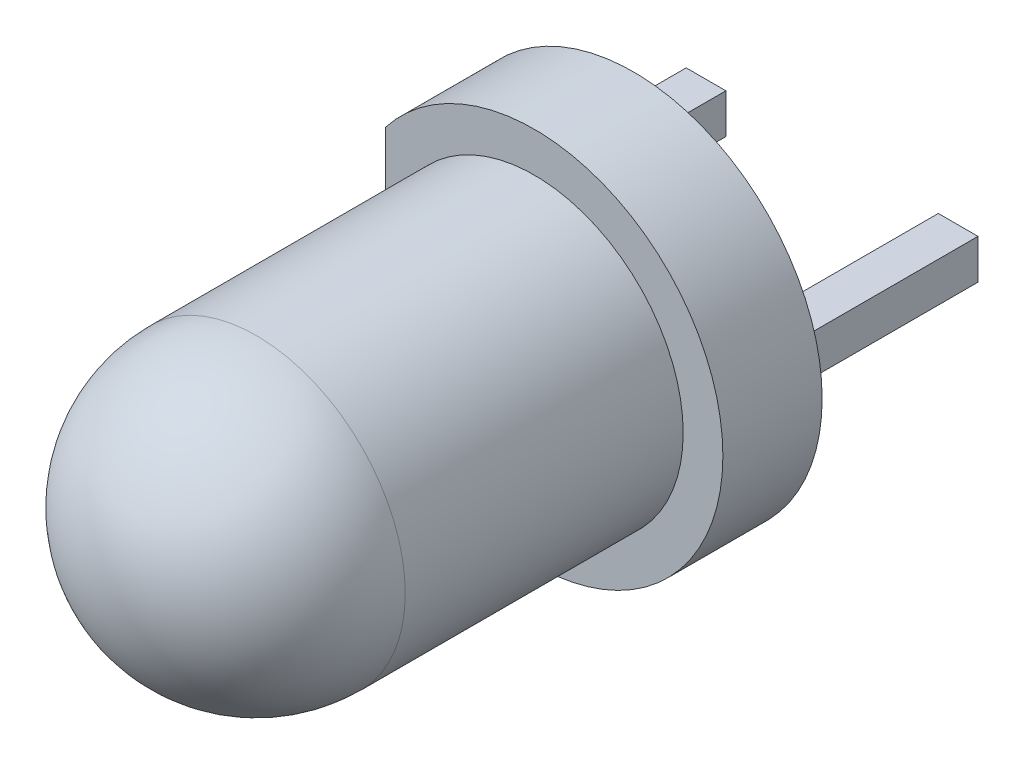
ISO-10303-21;
HEADER;
FILE_DESCRIPTION(('STEP AP214'),'2;1');
FILE_NAME('part.step','',(''),(''),'','','');
FILE_SCHEMA(('AUTOMOTIVE_DESIGN { 1 0 10303 214 1 1 1 1 }'));
ENDSEC;
DATA;
#1=APPLICATION_CONTEXT('core data for automotive mechanical design processes');
#2=APPLICATION_PROTOCOL_DEFINITION('international standard','automotive_design',2000,#1);
#3=PRODUCT_CONTEXT('',#1,'mechanical');
#4=PRODUCT('Part','Part','',(#3));
#5=PRODUCT_RELATED_PRODUCT_CATEGORY('part','',(#4));
#6=PRODUCT_DEFINITION_FORMATION('','',#4);
#7=PRODUCT_DEFINITION_CONTEXT('part definition',#1,'design');
#8=PRODUCT_DEFINITION('design','',#6,#7);
#9=PRODUCT_DEFINITION_SHAPE('','',#8);
#10=(LENGTH_UNIT() NAMED_UNIT(*) SI_UNIT(.MILLI.,.METRE.));
#11=(NAMED_UNIT(*) PLANE_ANGLE_UNIT() SI_UNIT($,.RADIAN.));
#12=(NAMED_UNIT(*) SI_UNIT($,.STERADIAN.) SOLID_ANGLE_UNIT());
#13=UNCERTAINTY_MEASURE_WITH_UNIT(LENGTH_MEASURE(1.E-05),#10,'distance_accuracy_value','');
#14=(GEOMETRIC_REPRESENTATION_CONTEXT(3) GLOBAL_UNCERTAINTY_ASSIGNED_CONTEXT((#13)) GLOBAL_UNIT_ASSIGNED_CONTEXT((#10,
#11,#12)) REPRESENTATION_CONTEXT('',''));
#15=CARTESIAN_POINT('',(0.,0.,0.));
#16=DIRECTION('',(0.,0.,1.));
#17=DIRECTION('',(1.,0.,0.));
#18=AXIS2_PLACEMENT_3D('',#15,#16,#17);
#19=CARTESIAN_POINT('',(1.27,0.,6.8));
#20=DIRECTION('',(0.,0.,1.));
#21=DIRECTION('',(1.,0.,0.));
#22=AXIS2_PLACEMENT_3D('',#19,#20,#21);
#23=SPHERICAL_SURFACE('',#22,1.5);
#24=CARTESIAN_POINT('',(1.27,0.,6.8));
#25=DIRECTION('',(0.,-1.,0.));
#26=DIRECTION('',(1.,0.,0.));
#27=AXIS2_PLACEMENT_3D('',#24,#25,#26);
#28=CIRCLE('',#27,1.5);
#29=CARTESIAN_POINT('',(2.77,0.,6.8));
#30=VERTEX_POINT('',#29);
#31=CARTESIAN_POINT('',(1.27,0.,8.3));
#32=VERTEX_POINT('',#31);
#33=EDGE_CURVE('E46',#30,#32,#28,.T.);
#34=ORIENTED_EDGE('',*,*,#33,.T.);
#35=ORIENTED_EDGE('',*,*,#33,.F.);
#36=CARTESIAN_POINT('',(1.27,0.,6.8));
#37=DIRECTION('',(0.,0.,-1.));
#38=DIRECTION('',(1.,0.,0.));
#39=AXIS2_PLACEMENT_3D('',#36,#37,#38);
#40=CIRCLE('',#39,1.5);
#41=EDGE_CURVE('E185',#30,#30,#40,.T.);
#42=ORIENTED_EDGE('',*,*,#41,.F.);
#43=EDGE_LOOP('',(#34,#35,#42));
#44=FACE_BOUND('',#43,.T.);
#45=ADVANCED_FACE('F38',(#44),#23,.T.);
#46=CARTESIAN_POINT('',(1.27,0.,6.8));
#47=DIRECTION('',(0.,0.,-1.));
#48=DIRECTION('',(1.,0.,0.));
#49=AXIS2_PLACEMENT_3D('',#46,#47,#48);
#50=CYLINDRICAL_SURFACE('',#49,1.5);
#51=DIRECTION('',(0.,0.,-1.));
#52=VECTOR('',#51,1.);
#53=CARTESIAN_POINT('',(2.77,0.,6.8));
#54=LINE('',#53,#52);
#55=CARTESIAN_POINT('',(2.77,0.,4.));
#56=VERTEX_POINT('',#55);
#57=EDGE_CURVE('E182',#30,#56,#54,.T.);
#58=ORIENTED_EDGE('',*,*,#57,.F.);
#59=ORIENTED_EDGE('',*,*,#41,.T.);
#60=ORIENTED_EDGE('',*,*,#57,.T.);
#61=CARTESIAN_POINT('',(1.27,0.,4.));
#62=DIRECTION('',(0.,0.,-1.));
#63=DIRECTION('',(1.,0.,0.));
#64=AXIS2_PLACEMENT_3D('',#61,#62,#63);
#65=CIRCLE('',#64,1.5);
#66=CARTESIAN_POINT('',(-0.23,-7.823615514024E-09,4.));
#67=VERTEX_POINT('',#66);
#68=EDGE_CURVE('E186',#67,#56,#65,.T.);
#69=ORIENTED_EDGE('',*,*,#68,.F.);
#70=CARTESIAN_POINT('',(1.27,0.,4.));
#71=DIRECTION('',(0.,0.,-1.));
#72=DIRECTION('',(1.,0.,0.));
#73=AXIS2_PLACEMENT_3D('',#70,#71,#72);
#74=CIRCLE('',#73,1.5);
#75=EDGE_CURVE('E192',#56,#67,#74,.T.);
#76=ORIENTED_EDGE('',*,*,#75,.F.);
#77=EDGE_LOOP('',(#58,#59,#60,#69,#76));
#78=FACE_BOUND('',#77,.T.);
#79=ADVANCED_FACE('F255',(#78),#50,.T.);
#80=CARTESIAN_POINT('',(-0.23,-1.166190378969,4.));
#81=DIRECTION('',(0.,0.,-1.));
#82=DIRECTION('',(0.,-1.,0.));
#83=AXIS2_PLACEMENT_3D('',#80,#81,#82);
#84=PLANE('',#83);
#85=DIRECTION('',(0.,1.,0.));
#86=VECTOR('',#85,1.);
#87=CARTESIAN_POINT('',(-0.23,-1.16619037897,4.));
#88=LINE('',#87,#86);
#89=CARTESIAN_POINT('',(-0.23,1.16619037897,4.));
#90=VERTEX_POINT('',#89);
#91=EDGE_CURVE('E191',#67,#90,#88,.T.);
#92=ORIENTED_EDGE('',*,*,#91,.F.);
#93=ORIENTED_EDGE('',*,*,#68,.T.);
#94=ORIENTED_EDGE('',*,*,#75,.T.);
#95=DIRECTION('',(0.,1.,0.));
#96=VECTOR('',#95,1.);
#97=CARTESIAN_POINT('',(-0.23,-1.16619037897,4.));
#98=LINE('',#97,#96);
#99=CARTESIAN_POINT('',(-0.23,-1.16619037897,4.));
#100=VERTEX_POINT('',#99);
#101=EDGE_CURVE('E187',#100,#67,#98,.T.);
#102=ORIENTED_EDGE('',*,*,#101,.F.);
#103=CARTESIAN_POINT('',(1.27,0.,4.));
#104=DIRECTION('',(0.,0.,1.));
#105=DIRECTION('',(1.,0.,0.));
#106=AXIS2_PLACEMENT_3D('',#103,#104,#105);
#107=CIRCLE('',#106,1.9);
#108=EDGE_CURVE('E156',#100,#90,#107,.T.);
#109=ORIENTED_EDGE('',*,*,#108,.T.);
#110=EDGE_LOOP('',(#92,#93,#94,#102,#109));
#111=FACE_BOUND('',#110,.T.);
#112=ADVANCED_FACE('F260',(#111),#84,.F.);
#113=CARTESIAN_POINT('',(1.27,0.,3.));
#114=DIRECTION('',(0.,0.,-1.));
#115=DIRECTION('',(1.,0.,0.));
#116=AXIS2_PLACEMENT_3D('',#113,#114,#115);
#117=CYLINDRICAL_SURFACE('',#116,1.9);
#118=CARTESIAN_POINT('',(1.27,0.,3.));
#119=DIRECTION('',(0.,0.,1.));
#120=DIRECTION('',(1.,0.,0.));
#121=AXIS2_PLACEMENT_3D('',#118,#119,#120);
#122=CIRCLE('',#121,1.9);
#123=CARTESIAN_POINT('',(-0.23,-1.16619037897,3.));
#124=VERTEX_POINT('',#123);
#125=CARTESIAN_POINT('',(-0.23,1.16619037897,3.));
#126=VERTEX_POINT('',#125);
#127=EDGE_CURVE('E212',#124,#126,#122,.T.);
#128=ORIENTED_EDGE('',*,*,#127,.T.);
#129=DIRECTION('',(0.,0.,1.));
#130=VECTOR('',#129,1.);
#131=CARTESIAN_POINT('',(-0.23,1.16619037897,3.));
#132=LINE('',#131,#130);
#133=EDGE_CURVE('E210',#126,#90,#132,.T.);
#134=ORIENTED_EDGE('',*,*,#133,.T.);
#135=ORIENTED_EDGE('',*,*,#108,.F.);
#136=DIRECTION('',(0.,0.,1.));
#137=VECTOR('',#136,1.);
#138=CARTESIAN_POINT('',(-0.23,-1.16619037897,3.));
#139=LINE('',#138,#137);
#140=EDGE_CURVE('E190',#124,#100,#139,.T.);
#141=ORIENTED_EDGE('',*,*,#140,.F.);
#142=EDGE_LOOP('',(#128,#134,#135,#141));
#143=FACE_BOUND('',#142,.T.);
#144=ADVANCED_FACE('F272',(#143),#117,.T.);
#145=CARTESIAN_POINT('',(-0.23,-1.16619037897,3.));
#146=DIRECTION('',(-1.,0.,0.));
#147=DIRECTION('',(0.,0.,1.));
#148=AXIS2_PLACEMENT_3D('',#145,#146,#147);
#149=PLANE('',#148);
#150=ORIENTED_EDGE('',*,*,#140,.T.);
#151=ORIENTED_EDGE('',*,*,#101,.T.);
#152=ORIENTED_EDGE('',*,*,#91,.T.);
#153=ORIENTED_EDGE('',*,*,#133,.F.);
#154=DIRECTION('',(0.,1.,0.));
#155=VECTOR('',#154,1.);
#156=CARTESIAN_POINT('',(-0.23,-1.16619037897,3.));
#157=LINE('',#156,#155);
#158=EDGE_CURVE('E198',#124,#126,#157,.T.);
#159=ORIENTED_EDGE('',*,*,#158,.F.);
#160=EDGE_LOOP('',(#150,#151,#152,#153,#159));
#161=FACE_BOUND('',#160,.T.);
#162=ADVANCED_FACE('F266',(#161),#149,.T.);
#163=CARTESIAN_POINT('',(-0.23,-1.166190378969,3.));
#164=DIRECTION('',(0.,0.,-1.));
#165=DIRECTION('',(0.,-1.,0.));
#166=AXIS2_PLACEMENT_3D('',#163,#164,#165);
#167=PLANE('',#166);
#168=ORIENTED_EDGE('',*,*,#127,.F.);
#169=ORIENTED_EDGE('',*,*,#158,.T.);
#170=EDGE_LOOP('',(#168,#169));
#171=FACE_BOUND('',#170,.T.);
#172=DIRECTION('',(0.,1.,0.));
#173=VECTOR('',#172,1.);
#174=CARTESIAN_POINT('',(0.2,-0.483095189485,3.));
#175=LINE('',#174,#173);
#176=CARTESIAN_POINT('',(0.2,-0.2,3.));
#177=VERTEX_POINT('',#176);
#178=CARTESIAN_POINT('',(0.2,0.2,3.));
#179=VERTEX_POINT('',#178);
#180=EDGE_CURVE('E180',#177,#179,#175,.T.);
#181=ORIENTED_EDGE('',*,*,#180,.T.);
#182=DIRECTION('',(-1.,0.,0.));
#183=VECTOR('',#182,1.);
#184=CARTESIAN_POINT('',(-0.215,0.2,3.));
#185=LINE('',#184,#183);
#186=CARTESIAN_POINT('',(-0.2,0.2,3.));
#187=VERTEX_POINT('',#186);
#188=EDGE_CURVE('E207',#179,#187,#185,.T.);
#189=ORIENTED_EDGE('',*,*,#188,.T.);
#190=DIRECTION('',(0.,-1.,0.));
#191=VECTOR('',#190,1.);
#192=CARTESIAN_POINT('',(-0.2,-0.683095189485,3.));
#193=LINE('',#192,#191);
#194=CARTESIAN_POINT('',(-0.2,-0.2,3.));
#195=VERTEX_POINT('',#194);
#196=EDGE_CURVE('E196',#187,#195,#193,.T.);
#197=ORIENTED_EDGE('',*,*,#196,.T.);
#198=DIRECTION('',(1.,0.,0.));
#199=VECTOR('',#198,1.);
#200=CARTESIAN_POINT('',(-0.01499999999986,-0.2,3.));
#201=LINE('',#200,#199);
#202=EDGE_CURVE('E195',#195,#177,#201,.T.);
#203=ORIENTED_EDGE('',*,*,#202,.T.);
#204=EDGE_LOOP('',(#181,#189,#197,#203));
#205=FACE_BOUND('',#204,.T.);
#206=DIRECTION('',(-1.,0.,0.));
#207=VECTOR('',#206,1.);
#208=CARTESIAN_POINT('',(1.055,0.2,3.));
#209=LINE('',#208,#207);
#210=CARTESIAN_POINT('',(2.74,0.2,3.));
#211=VERTEX_POINT('',#210);
#212=CARTESIAN_POINT('',(2.34,0.2,3.));
#213=VERTEX_POINT('',#212);
#214=EDGE_CURVE('E197',#211,#213,#209,.T.);
#215=ORIENTED_EDGE('',*,*,#214,.T.);
#216=DIRECTION('',(0.,-1.,0.));
#217=VECTOR('',#216,1.);
#218=CARTESIAN_POINT('',(2.34,-0.683095189485,3.));
#219=LINE('',#218,#217);
#220=CARTESIAN_POINT('',(2.34,-0.2,3.));
#221=VERTEX_POINT('',#220);
#222=EDGE_CURVE('E144',#213,#221,#219,.T.);
#223=ORIENTED_EDGE('',*,*,#222,.T.);
#224=DIRECTION('',(1.,0.,0.));
#225=VECTOR('',#224,1.);
#226=CARTESIAN_POINT('',(1.255,-0.2,3.));
#227=LINE('',#226,#225);
#228=CARTESIAN_POINT('',(2.74,-0.2,3.));
#229=VERTEX_POINT('',#228);
#230=EDGE_CURVE('E165',#221,#229,#227,.T.);
#231=ORIENTED_EDGE('',*,*,#230,.T.);
#232=DIRECTION('',(0.,1.,0.));
#233=VECTOR('',#232,1.);
#234=CARTESIAN_POINT('',(2.74,-0.483095189485,3.));
#235=LINE('',#234,#233);
#236=EDGE_CURVE('E163',#229,#211,#235,.T.);
#237=ORIENTED_EDGE('',*,*,#236,.T.);
#238=EDGE_LOOP('',(#215,#223,#231,#237));
#239=FACE_BOUND('',#238,.T.);
#240=ADVANCED_FACE('F234',(#171,#205,#239),#167,.T.);
#241=CARTESIAN_POINT('',(0.2,0.2,3.5));
#242=DIRECTION('',(-1.,0.,0.));
#243=DIRECTION('',(0.,0.,1.));
#244=AXIS2_PLACEMENT_3D('',#241,#242,#243);
#245=PLANE('',#244);
#246=DIRECTION('',(0.,0.,-1.));
#247=VECTOR('',#246,1.);
#248=CARTESIAN_POINT('',(0.2,-0.2,3.5));
#249=LINE('',#248,#247);
#250=CARTESIAN_POINT('',(0.2,-0.2,1.));
#251=VERTEX_POINT('',#250);
#252=EDGE_CURVE('E160',#177,#251,#249,.T.);
#253=ORIENTED_EDGE('',*,*,#252,.T.);
#254=DIRECTION('',(0.,1.,0.));
#255=VECTOR('',#254,1.);
#256=CARTESIAN_POINT('',(0.2,0.2,1.));
#257=LINE('',#256,#255);
#258=CARTESIAN_POINT('',(0.2,0.2,1.));
#259=VERTEX_POINT('',#258);
#260=EDGE_CURVE('E147',#251,#259,#257,.T.);
#261=ORIENTED_EDGE('',*,*,#260,.T.);
#262=DIRECTION('',(0.,0.,-1.));
#263=VECTOR('',#262,1.);
#264=CARTESIAN_POINT('',(0.2,0.2,3.5));
#265=LINE('',#264,#263);
#266=EDGE_CURVE('E168',#179,#259,#265,.T.);
#267=ORIENTED_EDGE('',*,*,#266,.F.);
#268=ORIENTED_EDGE('',*,*,#180,.F.);
#269=EDGE_LOOP('',(#253,#261,#267,#268));
#270=FACE_BOUND('',#269,.T.);
#271=ADVANCED_FACE('F246',(#270),#245,.F.);
#272=CARTESIAN_POINT('',(0.2,-0.2,3.5));
#273=DIRECTION('',(0.,1.,0.));
#274=DIRECTION('',(1.,0.,0.));
#275=AXIS2_PLACEMENT_3D('',#272,#273,#274);
#276=PLANE('',#275);
#277=DIRECTION('',(0.,0.,-1.));
#278=VECTOR('',#277,1.);
#279=CARTESIAN_POINT('',(-0.2,-0.2,3.5));
#280=LINE('',#279,#278);
#281=CARTESIAN_POINT('',(-0.2,-0.2,1.));
#282=VERTEX_POINT('',#281);
#283=EDGE_CURVE('E164',#195,#282,#280,.T.);
#284=ORIENTED_EDGE('',*,*,#283,.T.);
#285=DIRECTION('',(1.,0.,0.));
#286=VECTOR('',#285,1.);
#287=CARTESIAN_POINT('',(0.2,-0.2,1.));
#288=LINE('',#287,#286);
#289=EDGE_CURVE('E152',#282,#251,#288,.T.);
#290=ORIENTED_EDGE('',*,*,#289,.T.);
#291=ORIENTED_EDGE('',*,*,#252,.F.);
#292=ORIENTED_EDGE('',*,*,#202,.F.);
#293=EDGE_LOOP('',(#284,#290,#291,#292));
#294=FACE_BOUND('',#293,.T.);
#295=ADVANCED_FACE('F40',(#294),#276,.F.);
#296=CARTESIAN_POINT('',(-0.2,-0.2,3.5));
#297=DIRECTION('',(1.,0.,0.));
#298=DIRECTION('',(0.,1.,0.));
#299=AXIS2_PLACEMENT_3D('',#296,#297,#298);
#300=PLANE('',#299);
#301=DIRECTION('',(0.,0.,-1.));
#302=VECTOR('',#301,1.);
#303=CARTESIAN_POINT('',(-0.2,0.2,3.5));
#304=LINE('',#303,#302);
#305=CARTESIAN_POINT('',(-0.2,0.2,1.));
#306=VERTEX_POINT('',#305);
#307=EDGE_CURVE('E166',#187,#306,#304,.T.);
#308=ORIENTED_EDGE('',*,*,#307,.T.);
#309=DIRECTION('',(0.,-1.,0.));
#310=VECTOR('',#309,1.);
#311=CARTESIAN_POINT('',(-0.2,-0.2,1.));
#312=LINE('',#311,#310);
#313=EDGE_CURVE('E53',#306,#282,#312,.T.);
#314=ORIENTED_EDGE('',*,*,#313,.T.);
#315=ORIENTED_EDGE('',*,*,#283,.F.);
#316=ORIENTED_EDGE('',*,*,#196,.F.);
#317=EDGE_LOOP('',(#308,#314,#315,#316));
#318=FACE_BOUND('',#317,.T.);
#319=ADVANCED_FACE('F267',(#318),#300,.F.);
#320=CARTESIAN_POINT('',(-0.2,0.2,3.5));
#321=DIRECTION('',(0.,-1.,0.));
#322=DIRECTION('',(0.,0.,-1.));
#323=AXIS2_PLACEMENT_3D('',#320,#321,#322);
#324=PLANE('',#323);
#325=ORIENTED_EDGE('',*,*,#266,.T.);
#326=DIRECTION('',(-1.,0.,0.));
#327=VECTOR('',#326,1.);
#328=CARTESIAN_POINT('',(-0.2,0.2,1.));
#329=LINE('',#328,#327);
#330=EDGE_CURVE('E139',#259,#306,#329,.T.);
#331=ORIENTED_EDGE('',*,*,#330,.T.);
#332=ORIENTED_EDGE('',*,*,#307,.F.);
#333=ORIENTED_EDGE('',*,*,#188,.F.);
#334=EDGE_LOOP('',(#325,#331,#332,#333));
#335=FACE_BOUND('',#334,.T.);
#336=ADVANCED_FACE('F237',(#335),#324,.F.);
#337=CARTESIAN_POINT('',(2.34,0.2,3.5));
#338=DIRECTION('',(0.,-1.,0.));
#339=DIRECTION('',(0.,0.,-1.));
#340=AXIS2_PLACEMENT_3D('',#337,#338,#339);
#341=PLANE('',#340);
#342=DIRECTION('',(0.,0.,-1.));
#343=VECTOR('',#342,1.);
#344=CARTESIAN_POINT('',(2.74,0.2,3.5));
#345=LINE('',#344,#343);
#346=CARTESIAN_POINT('',(2.74,0.2,1.));
#347=VERTEX_POINT('',#346);
#348=EDGE_CURVE('E138',#211,#347,#345,.T.);
#349=ORIENTED_EDGE('',*,*,#348,.T.);
#350=DIRECTION('',(-1.,0.,0.));
#351=VECTOR('',#350,1.);
#352=CARTESIAN_POINT('',(2.34,0.2,1.));
#353=LINE('',#352,#351);
#354=CARTESIAN_POINT('',(2.34,0.2,1.));
#355=VERTEX_POINT('',#354);
#356=EDGE_CURVE('E125',#347,#355,#353,.T.);
#357=ORIENTED_EDGE('',*,*,#356,.T.);
#358=DIRECTION('',(0.,0.,-1.));
#359=VECTOR('',#358,1.);
#360=CARTESIAN_POINT('',(2.34,0.2,3.5));
#361=LINE('',#360,#359);
#362=EDGE_CURVE('E136',#213,#355,#361,.T.);
#363=ORIENTED_EDGE('',*,*,#362,.F.);
#364=ORIENTED_EDGE('',*,*,#214,.F.);
#365=EDGE_LOOP('',(#349,#357,#363,#364));
#366=FACE_BOUND('',#365,.T.);
#367=ADVANCED_FACE('F134',(#366),#341,.F.);
#368=CARTESIAN_POINT('',(2.74,0.2,3.5));
#369=DIRECTION('',(-1.,0.,0.));
#370=DIRECTION('',(0.,0.,1.));
#371=AXIS2_PLACEMENT_3D('',#368,#369,#370);
#372=PLANE('',#371);
#373=DIRECTION('',(0.,0.,-1.));
#374=VECTOR('',#373,1.);
#375=CARTESIAN_POINT('',(2.74,-0.2,3.5));
#376=LINE('',#375,#374);
#377=CARTESIAN_POINT('',(2.74,-0.2,1.));
#378=VERTEX_POINT('',#377);
#379=EDGE_CURVE('E149',#229,#378,#376,.T.);
#380=ORIENTED_EDGE('',*,*,#379,.T.);
#381=DIRECTION('',(0.,1.,0.));
#382=VECTOR('',#381,1.);
#383=CARTESIAN_POINT('',(2.74,0.2,1.));
#384=LINE('',#383,#382);
#385=EDGE_CURVE('E140',#378,#347,#384,.T.);
#386=ORIENTED_EDGE('',*,*,#385,.T.);
#387=ORIENTED_EDGE('',*,*,#348,.F.);
#388=ORIENTED_EDGE('',*,*,#236,.F.);
#389=EDGE_LOOP('',(#380,#386,#387,#388));
#390=FACE_BOUND('',#389,.T.);
#391=ADVANCED_FACE('F277',(#390),#372,.F.);
#392=CARTESIAN_POINT('',(2.74,-0.2,3.5));
#393=DIRECTION('',(0.,1.,0.));
#394=DIRECTION('',(1.,0.,0.));
#395=AXIS2_PLACEMENT_3D('',#392,#393,#394);
#396=PLANE('',#395);
#397=DIRECTION('',(0.,0.,-1.));
#398=VECTOR('',#397,1.);
#399=CARTESIAN_POINT('',(2.34,-0.2,3.5));
#400=LINE('',#399,#398);
#401=CARTESIAN_POINT('',(2.34,-0.2,1.));
#402=VERTEX_POINT('',#401);
#403=EDGE_CURVE('E146',#221,#402,#400,.T.);
#404=ORIENTED_EDGE('',*,*,#403,.T.);
#405=DIRECTION('',(1.,0.,0.));
#406=VECTOR('',#405,1.);
#407=CARTESIAN_POINT('',(2.74,-0.2,1.));
#408=LINE('',#407,#406);
#409=EDGE_CURVE('E61',#402,#378,#408,.T.);
#410=ORIENTED_EDGE('',*,*,#409,.T.);
#411=ORIENTED_EDGE('',*,*,#379,.F.);
#412=ORIENTED_EDGE('',*,*,#230,.F.);
#413=EDGE_LOOP('',(#404,#410,#411,#412));
#414=FACE_BOUND('',#413,.T.);
#415=ADVANCED_FACE('F280',(#414),#396,.F.);
#416=CARTESIAN_POINT('',(2.34,-0.2,3.5));
#417=DIRECTION('',(1.,0.,0.));
#418=DIRECTION('',(0.,1.,0.));
#419=AXIS2_PLACEMENT_3D('',#416,#417,#418);
#420=PLANE('',#419);
#421=ORIENTED_EDGE('',*,*,#362,.T.);
#422=DIRECTION('',(0.,-1.,0.));
#423=VECTOR('',#422,1.);
#424=CARTESIAN_POINT('',(2.34,-0.2,1.));
#425=LINE('',#424,#423);
#426=EDGE_CURVE('E11',#355,#402,#425,.T.);
#427=ORIENTED_EDGE('',*,*,#426,.T.);
#428=ORIENTED_EDGE('',*,*,#403,.F.);
#429=ORIENTED_EDGE('',*,*,#222,.F.);
#430=EDGE_LOOP('',(#421,#427,#428,#429));
#431=FACE_BOUND('',#430,.T.);
#432=ADVANCED_FACE('F142',(#431),#420,.F.);
#433=CARTESIAN_POINT('',(0.,0.,1.));
#434=DIRECTION('',(0.,0.,1.));
#435=DIRECTION('',(1.,0.,0.));
#436=AXIS2_PLACEMENT_3D('',#433,#434,#435);
#437=PLANE('',#436);
#438=ORIENTED_EDGE('',*,*,#385,.F.);
#439=ORIENTED_EDGE('',*,*,#409,.F.);
#440=ORIENTED_EDGE('',*,*,#426,.F.);
#441=ORIENTED_EDGE('',*,*,#356,.F.);
#442=EDGE_LOOP('',(#438,#439,#440,#441));
#443=FACE_BOUND('',#442,.T.);
#444=ADVANCED_FACE('F124',(#443),#437,.F.);
#445=ORIENTED_EDGE('',*,*,#289,.F.);
#446=ORIENTED_EDGE('',*,*,#313,.F.);
#447=ORIENTED_EDGE('',*,*,#330,.F.);
#448=ORIENTED_EDGE('',*,*,#260,.F.);
#449=EDGE_LOOP('',(#445,#446,#447,#448));
#450=FACE_BOUND('',#449,.T.);
#451=ADVANCED_FACE('F247',(#450),#437,.F.);
#452=CLOSED_SHELL('',(#45,#79,#112,#144,#162,#240,#271,#295,#319,#336,#367,#391,#415,#432,#444,#451));
#453=MANIFOLD_SOLID_BREP('B2',#452);
#454=ADVANCED_BREP_SHAPE_REPRESENTATION('',(#18,#453),#14);
#455=SHAPE_DEFINITION_REPRESENTATION(#9,#454);
ENDSEC;
END-ISO-10303-21;
